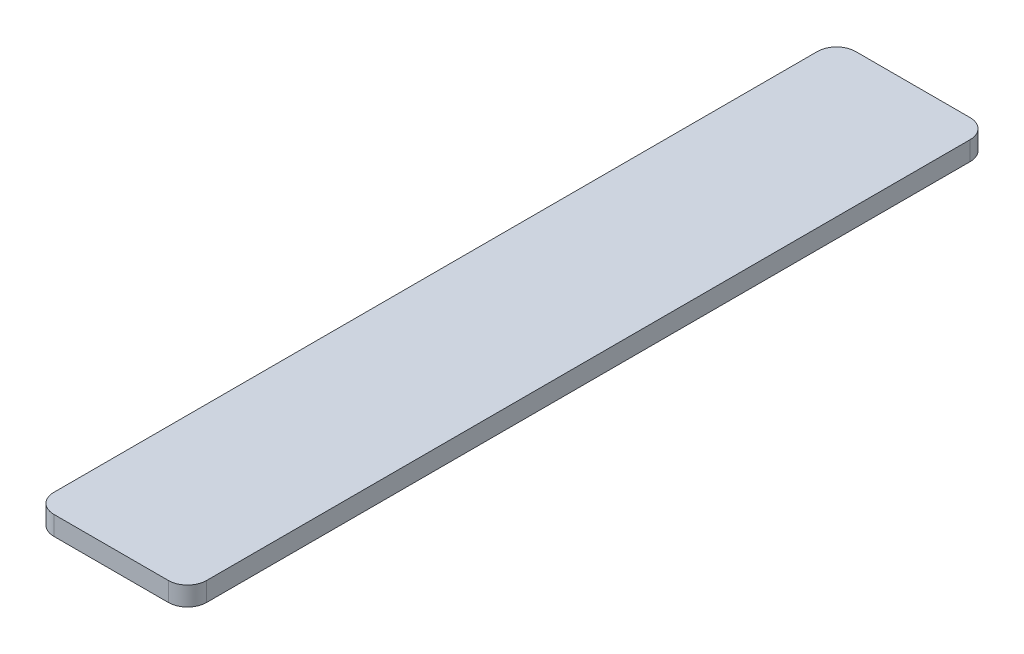
ISO-10303-21;
HEADER;
FILE_DESCRIPTION(('STEP AP214'),'2;1');
FILE_NAME('part.step','',(''),(''),'','','');
FILE_SCHEMA(('AUTOMOTIVE_DESIGN { 1 0 10303 214 1 1 1 1 }'));
ENDSEC;
DATA;
#1=APPLICATION_CONTEXT('core data for automotive mechanical design processes');
#2=APPLICATION_PROTOCOL_DEFINITION('international standard','automotive_design',2000,#1);
#3=PRODUCT_CONTEXT('',#1,'mechanical');
#4=PRODUCT('Part','Part','',(#3));
#5=PRODUCT_RELATED_PRODUCT_CATEGORY('part','',(#4));
#6=PRODUCT_DEFINITION_FORMATION('','',#4);
#7=PRODUCT_DEFINITION_CONTEXT('part definition',#1,'design');
#8=PRODUCT_DEFINITION('design','',#6,#7);
#9=PRODUCT_DEFINITION_SHAPE('','',#8);
#10=(LENGTH_UNIT() NAMED_UNIT(*) SI_UNIT(.MILLI.,.METRE.));
#11=(NAMED_UNIT(*) PLANE_ANGLE_UNIT() SI_UNIT($,.RADIAN.));
#12=(NAMED_UNIT(*) SI_UNIT($,.STERADIAN.) SOLID_ANGLE_UNIT());
#13=UNCERTAINTY_MEASURE_WITH_UNIT(LENGTH_MEASURE(1.E-05),#10,'distance_accuracy_value','');
#14=(GEOMETRIC_REPRESENTATION_CONTEXT(3) GLOBAL_UNCERTAINTY_ASSIGNED_CONTEXT((#13)) GLOBAL_UNIT_ASSIGNED_CONTEXT((#10,
#11,#12)) REPRESENTATION_CONTEXT('',''));
#15=CARTESIAN_POINT('',(0.,0.,0.));
#16=DIRECTION('',(0.,0.,1.));
#17=DIRECTION('',(1.,0.,0.));
#18=AXIS2_PLACEMENT_3D('',#15,#16,#17);
#19=CARTESIAN_POINT('',(-12.7,1.5875,66.675));
#20=DIRECTION('',(1.,0.,0.));
#21=DIRECTION('',(0.,0.,-1.));
#22=AXIS2_PLACEMENT_3D('',#19,#20,#21);
#23=PLANE('',#22);
#24=DIRECTION('',(0.,0.,-1.));
#25=VECTOR('',#24,1.);
#26=CARTESIAN_POINT('',(-12.7,-1.5875,66.675));
#27=LINE('',#26,#25);
#28=CARTESIAN_POINT('',(-12.7,-1.5875,63.5));
#29=VERTEX_POINT('',#28);
#30=CARTESIAN_POINT('',(-12.7,-1.5875,-63.5));
#31=VERTEX_POINT('',#30);
#32=EDGE_CURVE('E12',#29,#31,#27,.T.);
#33=ORIENTED_EDGE('',*,*,#32,.F.);
#34=DIRECTION('',(0.,1.,0.));
#35=VECTOR('',#34,1.);
#36=CARTESIAN_POINT('',(-12.7,-1.5875,63.5));
#37=LINE('',#36,#35);
#38=CARTESIAN_POINT('',(-12.7,1.5875,63.5));
#39=VERTEX_POINT('',#38);
#40=EDGE_CURVE('E153',#29,#39,#37,.T.);
#41=ORIENTED_EDGE('',*,*,#40,.T.);
#42=DIRECTION('',(0.,0.,-1.));
#43=VECTOR('',#42,1.);
#44=CARTESIAN_POINT('',(-12.7,1.5875,66.675));
#45=LINE('',#44,#43);
#46=CARTESIAN_POINT('',(-12.7,1.5875,-63.5));
#47=VERTEX_POINT('',#46);
#48=EDGE_CURVE('E133',#39,#47,#45,.T.);
#49=ORIENTED_EDGE('',*,*,#48,.T.);
#50=DIRECTION('',(0.,1.,0.));
#51=VECTOR('',#50,1.);
#52=CARTESIAN_POINT('',(-12.7,-1.5875,-63.5));
#53=LINE('',#52,#51);
#54=EDGE_CURVE('E169',#31,#47,#53,.T.);
#55=ORIENTED_EDGE('',*,*,#54,.F.);
#56=EDGE_LOOP('',(#33,#41,#49,#55));
#57=FACE_BOUND('',#56,.T.);
#58=ADVANCED_FACE('F43',(#57),#23,.F.);
#59=CARTESIAN_POINT('',(12.7,-1.5875,66.675));
#60=DIRECTION('',(0.,1.,0.));
#61=DIRECTION('',(0.,0.,1.));
#62=AXIS2_PLACEMENT_3D('',#59,#60,#61);
#63=PLANE('',#62);
#64=CARTESIAN_POINT('',(-9.525,-1.5875,63.5));
#65=DIRECTION('',(0.,1.,0.));
#66=DIRECTION('',(0.,0.,1.));
#67=AXIS2_PLACEMENT_3D('',#64,#65,#66);
#68=CIRCLE('',#67,3.17500000000001);
#69=CARTESIAN_POINT('',(-9.525,-1.5875,66.675));
#70=VERTEX_POINT('',#69);
#71=EDGE_CURVE('E66',#29,#70,#68,.T.);
#72=ORIENTED_EDGE('',*,*,#71,.F.);
#73=ORIENTED_EDGE('',*,*,#32,.T.);
#74=CARTESIAN_POINT('',(-9.525,-1.5875,-63.5));
#75=DIRECTION('',(0.,1.,0.));
#76=DIRECTION('',(0.,0.,1.));
#77=AXIS2_PLACEMENT_3D('',#74,#75,#76);
#78=CIRCLE('',#77,3.17500000000001);
#79=CARTESIAN_POINT('',(-9.525,-1.5875,-66.675));
#80=VERTEX_POINT('',#79);
#81=EDGE_CURVE('E157',#80,#31,#78,.T.);
#82=ORIENTED_EDGE('',*,*,#81,.F.);
#83=DIRECTION('',(1.,0.,0.));
#84=VECTOR('',#83,1.);
#85=CARTESIAN_POINT('',(12.7,-1.5875,-66.675));
#86=LINE('',#85,#84);
#87=CARTESIAN_POINT('',(9.525,-1.5875,-66.675));
#88=VERTEX_POINT('',#87);
#89=EDGE_CURVE('E150',#80,#88,#86,.T.);
#90=ORIENTED_EDGE('',*,*,#89,.T.);
#91=CARTESIAN_POINT('',(9.525,-1.5875,-63.5));
#92=DIRECTION('',(0.,1.,0.));
#93=DIRECTION('',(0.,0.,1.));
#94=AXIS2_PLACEMENT_3D('',#91,#92,#93);
#95=CIRCLE('',#94,3.17500000000001);
#96=CARTESIAN_POINT('',(12.7,-1.5875,-63.5));
#97=VERTEX_POINT('',#96);
#98=EDGE_CURVE('E116',#97,#88,#95,.T.);
#99=ORIENTED_EDGE('',*,*,#98,.F.);
#100=DIRECTION('',(0.,0.,-1.));
#101=VECTOR('',#100,1.);
#102=CARTESIAN_POINT('',(12.7,-1.5875,66.675));
#103=LINE('',#102,#101);
#104=CARTESIAN_POINT('',(12.7,-1.5875,63.5));
#105=VERTEX_POINT('',#104);
#106=EDGE_CURVE('E51',#105,#97,#103,.T.);
#107=ORIENTED_EDGE('',*,*,#106,.F.);
#108=CARTESIAN_POINT('',(9.525,-1.5875,63.5));
#109=DIRECTION('',(0.,1.,0.));
#110=DIRECTION('',(0.,0.,-1.));
#111=AXIS2_PLACEMENT_3D('',#108,#109,#110);
#112=CIRCLE('',#111,3.17500000000001);
#113=CARTESIAN_POINT('',(9.525,-1.5875,66.675));
#114=VERTEX_POINT('',#113);
#115=EDGE_CURVE('E106',#114,#105,#112,.T.);
#116=ORIENTED_EDGE('',*,*,#115,.F.);
#117=DIRECTION('',(1.,0.,0.));
#118=VECTOR('',#117,1.);
#119=CARTESIAN_POINT('',(12.7,-1.5875,66.675));
#120=LINE('',#119,#118);
#121=EDGE_CURVE('E143',#70,#114,#120,.T.);
#122=ORIENTED_EDGE('',*,*,#121,.F.);
#123=EDGE_LOOP('',(#72,#73,#82,#90,#99,#107,#116,#122));
#124=FACE_BOUND('',#123,.T.);
#125=ADVANCED_FACE('F129',(#124),#63,.F.);
#126=CARTESIAN_POINT('',(12.7,1.5875,66.675));
#127=DIRECTION('',(-1.,0.,0.));
#128=DIRECTION('',(0.,0.,1.));
#129=AXIS2_PLACEMENT_3D('',#126,#127,#128);
#130=PLANE('',#129);
#131=ORIENTED_EDGE('',*,*,#106,.T.);
#132=DIRECTION('',(0.,1.,0.));
#133=VECTOR('',#132,1.);
#134=CARTESIAN_POINT('',(12.7,-1.5875,-63.5));
#135=LINE('',#134,#133);
#136=CARTESIAN_POINT('',(12.7,1.5875,-63.5));
#137=VERTEX_POINT('',#136);
#138=EDGE_CURVE('E126',#97,#137,#135,.T.);
#139=ORIENTED_EDGE('',*,*,#138,.T.);
#140=DIRECTION('',(0.,0.,-1.));
#141=VECTOR('',#140,1.);
#142=CARTESIAN_POINT('',(12.7,1.5875,66.675));
#143=LINE('',#142,#141);
#144=CARTESIAN_POINT('',(12.7,1.5875,63.5));
#145=VERTEX_POINT('',#144);
#146=EDGE_CURVE('E124',#145,#137,#143,.T.);
#147=ORIENTED_EDGE('',*,*,#146,.F.);
#148=DIRECTION('',(0.,1.,0.));
#149=VECTOR('',#148,1.);
#150=CARTESIAN_POINT('',(12.7,-1.5875,63.5));
#151=LINE('',#150,#149);
#152=EDGE_CURVE('E109',#105,#145,#151,.T.);
#153=ORIENTED_EDGE('',*,*,#152,.F.);
#154=EDGE_LOOP('',(#131,#139,#147,#153));
#155=FACE_BOUND('',#154,.T.);
#156=ADVANCED_FACE('F121',(#155),#130,.F.);
#157=CARTESIAN_POINT('',(12.7,1.5875,66.675));
#158=DIRECTION('',(0.,-1.,0.));
#159=DIRECTION('',(0.,0.,-1.));
#160=AXIS2_PLACEMENT_3D('',#157,#158,#159);
#161=PLANE('',#160);
#162=CARTESIAN_POINT('',(-9.525,1.5875,63.5));
#163=DIRECTION('',(0.,1.,0.));
#164=DIRECTION('',(0.,0.,1.));
#165=AXIS2_PLACEMENT_3D('',#162,#163,#164);
#166=CIRCLE('',#165,3.17500000000001);
#167=CARTESIAN_POINT('',(-9.525,1.5875,66.675));
#168=VERTEX_POINT('',#167);
#169=EDGE_CURVE('E185',#39,#168,#166,.T.);
#170=ORIENTED_EDGE('',*,*,#169,.T.);
#171=DIRECTION('',(-1.,0.,0.));
#172=VECTOR('',#171,1.);
#173=CARTESIAN_POINT('',(12.7,1.5875,66.675));
#174=LINE('',#173,#172);
#175=CARTESIAN_POINT('',(9.525,1.5875,66.675));
#176=VERTEX_POINT('',#175);
#177=EDGE_CURVE('E139',#176,#168,#174,.T.);
#178=ORIENTED_EDGE('',*,*,#177,.F.);
#179=CARTESIAN_POINT('',(9.525,1.5875,63.5));
#180=DIRECTION('',(0.,1.,0.));
#181=DIRECTION('',(0.,0.,-1.));
#182=AXIS2_PLACEMENT_3D('',#179,#180,#181);
#183=CIRCLE('',#182,3.17500000000001);
#184=EDGE_CURVE('E58',#176,#145,#183,.T.);
#185=ORIENTED_EDGE('',*,*,#184,.T.);
#186=ORIENTED_EDGE('',*,*,#146,.T.);
#187=CARTESIAN_POINT('',(9.525,1.5875,-63.5));
#188=DIRECTION('',(0.,1.,0.));
#189=DIRECTION('',(0.,0.,1.));
#190=AXIS2_PLACEMENT_3D('',#187,#188,#189);
#191=CIRCLE('',#190,3.17500000000001);
#192=CARTESIAN_POINT('',(9.525,1.5875,-66.675));
#193=VERTEX_POINT('',#192);
#194=EDGE_CURVE('E179',#137,#193,#191,.T.);
#195=ORIENTED_EDGE('',*,*,#194,.T.);
#196=DIRECTION('',(-1.,0.,0.));
#197=VECTOR('',#196,1.);
#198=CARTESIAN_POINT('',(12.7,1.5875,-66.675));
#199=LINE('',#198,#197);
#200=CARTESIAN_POINT('',(-9.525,1.5875,-66.675));
#201=VERTEX_POINT('',#200);
#202=EDGE_CURVE('E146',#193,#201,#199,.T.);
#203=ORIENTED_EDGE('',*,*,#202,.T.);
#204=CARTESIAN_POINT('',(-9.525,1.5875,-63.5));
#205=DIRECTION('',(0.,1.,0.));
#206=DIRECTION('',(0.,0.,1.));
#207=AXIS2_PLACEMENT_3D('',#204,#205,#206);
#208=CIRCLE('',#207,3.17500000000001);
#209=EDGE_CURVE('E175',#201,#47,#208,.T.);
#210=ORIENTED_EDGE('',*,*,#209,.T.);
#211=ORIENTED_EDGE('',*,*,#48,.F.);
#212=EDGE_LOOP('',(#170,#178,#185,#186,#195,#203,#210,#211));
#213=FACE_BOUND('',#212,.T.);
#214=ADVANCED_FACE('F209',(#213),#161,.F.);
#215=CARTESIAN_POINT('',(0.,0.,66.675));
#216=DIRECTION('',(0.,0.,-1.));
#217=DIRECTION('',(-1.,0.,0.));
#218=AXIS2_PLACEMENT_3D('',#215,#216,#217);
#219=PLANE('',#218);
#220=DIRECTION('',(0.,1.,0.));
#221=VECTOR('',#220,1.);
#222=CARTESIAN_POINT('',(-9.525,-1.5875,66.675));
#223=LINE('',#222,#221);
#224=EDGE_CURVE('E154',#70,#168,#223,.T.);
#225=ORIENTED_EDGE('',*,*,#224,.F.);
#226=ORIENTED_EDGE('',*,*,#121,.T.);
#227=DIRECTION('',(0.,1.,0.));
#228=VECTOR('',#227,1.);
#229=CARTESIAN_POINT('',(9.525,-1.5875,66.675));
#230=LINE('',#229,#228);
#231=EDGE_CURVE('E110',#114,#176,#230,.T.);
#232=ORIENTED_EDGE('',*,*,#231,.T.);
#233=ORIENTED_EDGE('',*,*,#177,.T.);
#234=EDGE_LOOP('',(#225,#226,#232,#233));
#235=FACE_BOUND('',#234,.T.);
#236=ADVANCED_FACE('F212',(#235),#219,.F.);
#237=CARTESIAN_POINT('',(0.,0.,-66.675));
#238=DIRECTION('',(0.,0.,-1.));
#239=DIRECTION('',(-1.,0.,0.));
#240=AXIS2_PLACEMENT_3D('',#237,#238,#239);
#241=PLANE('',#240);
#242=ORIENTED_EDGE('',*,*,#89,.F.);
#243=DIRECTION('',(0.,1.,0.));
#244=VECTOR('',#243,1.);
#245=CARTESIAN_POINT('',(-9.525,-1.5875,-66.675));
#246=LINE('',#245,#244);
#247=EDGE_CURVE('E165',#80,#201,#246,.T.);
#248=ORIENTED_EDGE('',*,*,#247,.T.);
#249=ORIENTED_EDGE('',*,*,#202,.F.);
#250=DIRECTION('',(0.,1.,0.));
#251=VECTOR('',#250,1.);
#252=CARTESIAN_POINT('',(9.525,-1.5875,-66.675));
#253=LINE('',#252,#251);
#254=EDGE_CURVE('E162',#88,#193,#253,.T.);
#255=ORIENTED_EDGE('',*,*,#254,.F.);
#256=EDGE_LOOP('',(#242,#248,#249,#255));
#257=FACE_BOUND('',#256,.T.);
#258=ADVANCED_FACE('F200',(#257),#241,.T.);
#259=CARTESIAN_POINT('',(9.525,-1.5875,-63.5));
#260=DIRECTION('',(0.,1.,0.));
#261=DIRECTION('',(0.,0.,1.));
#262=AXIS2_PLACEMENT_3D('',#259,#260,#261);
#263=CYLINDRICAL_SURFACE('',#262,3.17500000000001);
#264=ORIENTED_EDGE('',*,*,#194,.F.);
#265=ORIENTED_EDGE('',*,*,#138,.F.);
#266=ORIENTED_EDGE('',*,*,#98,.T.);
#267=ORIENTED_EDGE('',*,*,#254,.T.);
#268=EDGE_LOOP('',(#264,#265,#266,#267));
#269=FACE_BOUND('',#268,.T.);
#270=ADVANCED_FACE('F196',(#269),#263,.T.);
#271=CARTESIAN_POINT('',(-9.525,-1.5875,-63.5));
#272=DIRECTION('',(0.,1.,0.));
#273=DIRECTION('',(0.,0.,1.));
#274=AXIS2_PLACEMENT_3D('',#271,#272,#273);
#275=CYLINDRICAL_SURFACE('',#274,3.17500000000001);
#276=ORIENTED_EDGE('',*,*,#209,.F.);
#277=ORIENTED_EDGE('',*,*,#247,.F.);
#278=ORIENTED_EDGE('',*,*,#81,.T.);
#279=ORIENTED_EDGE('',*,*,#54,.T.);
#280=EDGE_LOOP('',(#276,#277,#278,#279));
#281=FACE_BOUND('',#280,.T.);
#282=ADVANCED_FACE('F205',(#281),#275,.T.);
#283=CARTESIAN_POINT('',(9.525,-1.5875,63.5));
#284=DIRECTION('',(0.,1.,0.));
#285=DIRECTION('',(0.,0.,1.));
#286=AXIS2_PLACEMENT_3D('',#283,#284,#285);
#287=CYLINDRICAL_SURFACE('',#286,3.17500000000001);
#288=ORIENTED_EDGE('',*,*,#184,.F.);
#289=ORIENTED_EDGE('',*,*,#231,.F.);
#290=ORIENTED_EDGE('',*,*,#115,.T.);
#291=ORIENTED_EDGE('',*,*,#152,.T.);
#292=EDGE_LOOP('',(#288,#289,#290,#291));
#293=FACE_BOUND('',#292,.T.);
#294=ADVANCED_FACE('F108',(#293),#287,.T.);
#295=CARTESIAN_POINT('',(-9.525,-1.5875,63.5));
#296=DIRECTION('',(0.,1.,0.));
#297=DIRECTION('',(0.,0.,1.));
#298=AXIS2_PLACEMENT_3D('',#295,#296,#297);
#299=CYLINDRICAL_SURFACE('',#298,3.17500000000001);
#300=ORIENTED_EDGE('',*,*,#169,.F.);
#301=ORIENTED_EDGE('',*,*,#40,.F.);
#302=ORIENTED_EDGE('',*,*,#71,.T.);
#303=ORIENTED_EDGE('',*,*,#224,.T.);
#304=EDGE_LOOP('',(#300,#301,#302,#303));
#305=FACE_BOUND('',#304,.T.);
#306=ADVANCED_FACE('F213',(#305),#299,.T.);
#307=CLOSED_SHELL('',(#58,#125,#156,#214,#236,#258,#270,#282,#294,#306));
#308=MANIFOLD_SOLID_BREP('B2',#307);
#309=ADVANCED_BREP_SHAPE_REPRESENTATION('',(#18,#308),#14);
#310=SHAPE_DEFINITION_REPRESENTATION(#9,#309);
ENDSEC;
END-ISO-10303-21;
